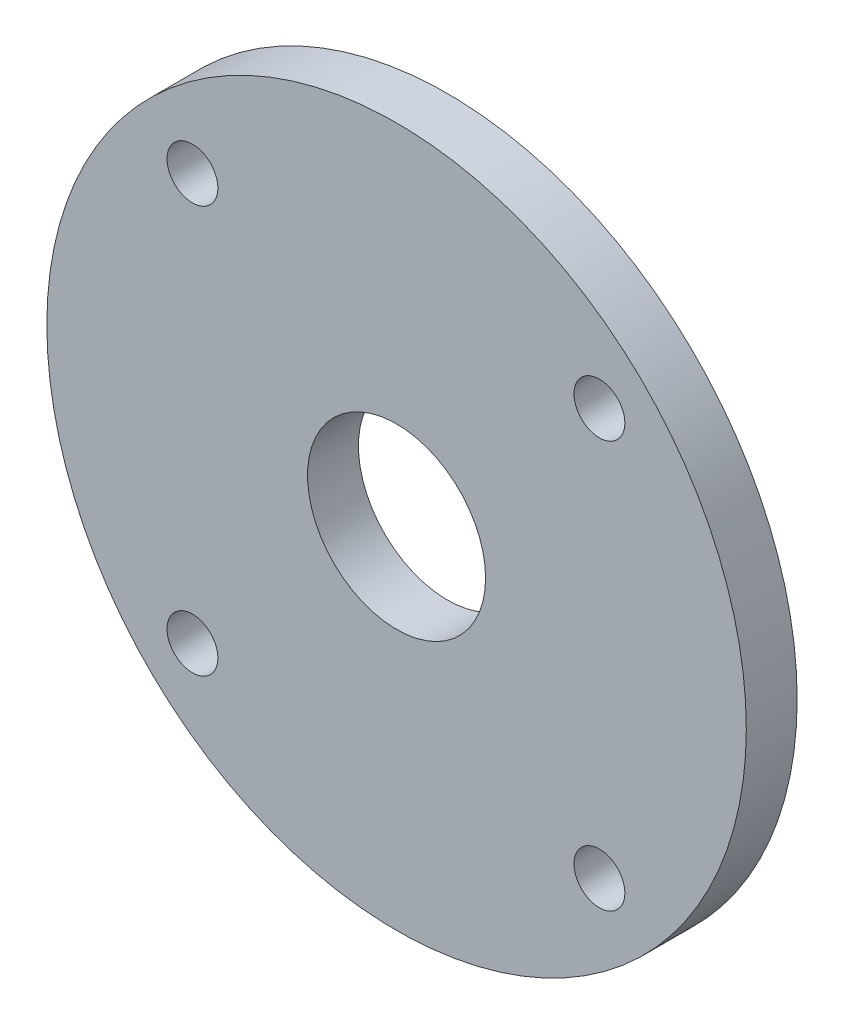
ISO-10303-21;
HEADER;
FILE_DESCRIPTION(('STEP AP214'),'2;1');
FILE_NAME('part.step','',(''),(''),'','','');
FILE_SCHEMA(('AUTOMOTIVE_DESIGN { 1 0 10303 214 1 1 1 1 }'));
ENDSEC;
DATA;
#1=APPLICATION_CONTEXT('core data for automotive mechanical design processes');
#2=APPLICATION_PROTOCOL_DEFINITION('international standard','automotive_design',2000,#1);
#3=PRODUCT_CONTEXT('',#1,'mechanical');
#4=PRODUCT('Part','Part','',(#3));
#5=PRODUCT_RELATED_PRODUCT_CATEGORY('part','',(#4));
#6=PRODUCT_DEFINITION_FORMATION('','',#4);
#7=PRODUCT_DEFINITION_CONTEXT('part definition',#1,'design');
#8=PRODUCT_DEFINITION('design','',#6,#7);
#9=PRODUCT_DEFINITION_SHAPE('','',#8);
#10=(LENGTH_UNIT() NAMED_UNIT(*) SI_UNIT(.MILLI.,.METRE.));
#11=(NAMED_UNIT(*) PLANE_ANGLE_UNIT() SI_UNIT($,.RADIAN.));
#12=(NAMED_UNIT(*) SI_UNIT($,.STERADIAN.) SOLID_ANGLE_UNIT());
#13=UNCERTAINTY_MEASURE_WITH_UNIT(LENGTH_MEASURE(1.E-05),#10,'distance_accuracy_value','');
#14=(GEOMETRIC_REPRESENTATION_CONTEXT(3) GLOBAL_UNCERTAINTY_ASSIGNED_CONTEXT((#13)) GLOBAL_UNIT_ASSIGNED_CONTEXT((#10,
#11,#12)) REPRESENTATION_CONTEXT('',''));
#15=CARTESIAN_POINT('',(0.,0.,0.));
#16=DIRECTION('',(0.,0.,1.));
#17=DIRECTION('',(1.,0.,0.));
#18=AXIS2_PLACEMENT_3D('',#15,#16,#17);
#19=CARTESIAN_POINT('',(0.,0.,4.));
#20=DIRECTION('',(0.,0.,-1.));
#21=DIRECTION('',(-1.,0.,0.));
#22=AXIS2_PLACEMENT_3D('',#19,#20,#21);
#23=CYLINDRICAL_SURFACE('',#22,27.5);
#24=CARTESIAN_POINT('',(0.,0.,4.));
#25=DIRECTION('',(0.,0.,1.));
#26=DIRECTION('',(1.,0.,0.));
#27=AXIS2_PLACEMENT_3D('',#24,#25,#26);
#28=CIRCLE('',#27,27.5);
#29=CARTESIAN_POINT('',(27.5,0.,4.));
#30=VERTEX_POINT('',#29);
#31=EDGE_CURVE('E10',#30,#30,#28,.T.);
#32=ORIENTED_EDGE('',*,*,#31,.F.);
#33=EDGE_LOOP('',(#32));
#34=FACE_BOUND('',#33,.T.);
#35=CARTESIAN_POINT('',(0.,0.,0.));
#36=DIRECTION('',(0.,0.,1.));
#37=DIRECTION('',(1.,0.,0.));
#38=AXIS2_PLACEMENT_3D('',#35,#36,#37);
#39=CIRCLE('',#38,27.5);
#40=CARTESIAN_POINT('',(27.5,0.,0.));
#41=VERTEX_POINT('',#40);
#42=EDGE_CURVE('E46',#41,#41,#39,.T.);
#43=ORIENTED_EDGE('',*,*,#42,.T.);
#44=EDGE_LOOP('',(#43));
#45=FACE_BOUND('',#44,.T.);
#46=ADVANCED_FACE('F43',(#34,#45),#23,.T.);
#47=CARTESIAN_POINT('',(0.,0.,4.));
#48=DIRECTION('',(0.,0.,1.));
#49=DIRECTION('',(1.,0.,0.));
#50=AXIS2_PLACEMENT_3D('',#47,#48,#49);
#51=PLANE('',#50);
#52=CARTESIAN_POINT('',(0.,0.,4.));
#53=DIRECTION('',(0.,0.,1.));
#54=DIRECTION('',(1.,0.,0.));
#55=AXIS2_PLACEMENT_3D('',#52,#53,#54);
#56=CIRCLE('',#55,7.);
#57=CARTESIAN_POINT('',(7.,0.,4.));
#58=VERTEX_POINT('',#57);
#59=EDGE_CURVE('E89',#58,#58,#56,.T.);
#60=ORIENTED_EDGE('',*,*,#59,.F.);
#61=EDGE_LOOP('',(#60));
#62=FACE_BOUND('',#61,.T.);
#63=CARTESIAN_POINT('',(15.9505849957376,16.0247075021312,4.));
#64=DIRECTION('',(0.,0.,1.));
#65=DIRECTION('',(1.,0.,0.));
#66=AXIS2_PLACEMENT_3D('',#63,#64,#65);
#67=CIRCLE('',#66,2.);
#68=CARTESIAN_POINT('',(17.9505849957376,16.0247075021312,4.));
#69=VERTEX_POINT('',#68);
#70=EDGE_CURVE('E69',#69,#69,#67,.T.);
#71=ORIENTED_EDGE('',*,*,#70,.F.);
#72=EDGE_LOOP('',(#71));
#73=FACE_BOUND('',#72,.T.);
#74=CARTESIAN_POINT('',(15.9505849957376,-15.9752924978688,4.));
#75=DIRECTION('',(0.,0.,1.));
#76=DIRECTION('',(1.,0.,0.));
#77=AXIS2_PLACEMENT_3D('',#74,#75,#76);
#78=CIRCLE('',#77,2.);
#79=CARTESIAN_POINT('',(17.9505849957376,-15.9752924978688,4.));
#80=VERTEX_POINT('',#79);
#81=EDGE_CURVE('E78',#80,#80,#78,.T.);
#82=ORIENTED_EDGE('',*,*,#81,.F.);
#83=EDGE_LOOP('',(#82));
#84=FACE_BOUND('',#83,.T.);
#85=CARTESIAN_POINT('',(-16.0494150042624,-15.9752924978688,4.));
#86=DIRECTION('',(0.,0.,1.));
#87=DIRECTION('',(1.,0.,0.));
#88=AXIS2_PLACEMENT_3D('',#85,#86,#87);
#89=CIRCLE('',#88,2.);
#90=CARTESIAN_POINT('',(-14.0494150042624,-15.9752924978688,4.));
#91=VERTEX_POINT('',#90);
#92=EDGE_CURVE('E61',#91,#91,#89,.T.);
#93=ORIENTED_EDGE('',*,*,#92,.F.);
#94=EDGE_LOOP('',(#93));
#95=FACE_BOUND('',#94,.T.);
#96=CARTESIAN_POINT('',(-16.0494150042624,16.0247075021312,4.));
#97=DIRECTION('',(0.,0.,1.));
#98=DIRECTION('',(1.,0.,0.));
#99=AXIS2_PLACEMENT_3D('',#96,#97,#98);
#100=CIRCLE('',#99,2.);
#101=CARTESIAN_POINT('',(-14.0494150042624,16.0247075021312,4.));
#102=VERTEX_POINT('',#101);
#103=EDGE_CURVE('E57',#102,#102,#100,.T.);
#104=ORIENTED_EDGE('',*,*,#103,.F.);
#105=EDGE_LOOP('',(#104));
#106=FACE_BOUND('',#105,.T.);
#107=ORIENTED_EDGE('',*,*,#31,.T.);
#108=EDGE_LOOP('',(#107));
#109=FACE_BOUND('',#108,.T.);
#110=ADVANCED_FACE('F107',(#62,#73,#84,#95,#106,#109),#51,.T.);
#111=CARTESIAN_POINT('',(0.,0.,0.));
#112=DIRECTION('',(0.,0.,1.));
#113=DIRECTION('',(1.,0.,0.));
#114=AXIS2_PLACEMENT_3D('',#111,#112,#113);
#115=PLANE('',#114);
#116=CARTESIAN_POINT('',(0.,0.,0.));
#117=DIRECTION('',(0.,0.,1.));
#118=DIRECTION('',(1.,0.,0.));
#119=AXIS2_PLACEMENT_3D('',#116,#117,#118);
#120=CIRCLE('',#119,7.);
#121=CARTESIAN_POINT('',(7.,0.,0.));
#122=VERTEX_POINT('',#121);
#123=EDGE_CURVE('E70',#122,#122,#120,.T.);
#124=ORIENTED_EDGE('',*,*,#123,.T.);
#125=EDGE_LOOP('',(#124));
#126=FACE_BOUND('',#125,.T.);
#127=CARTESIAN_POINT('',(15.9505849957376,16.0247075021312,0.));
#128=DIRECTION('',(0.,0.,1.));
#129=DIRECTION('',(1.,0.,0.));
#130=AXIS2_PLACEMENT_3D('',#127,#128,#129);
#131=CIRCLE('',#130,2.);
#132=CARTESIAN_POINT('',(17.9505849957376,16.0247075021312,0.));
#133=VERTEX_POINT('',#132);
#134=EDGE_CURVE('E65',#133,#133,#131,.T.);
#135=ORIENTED_EDGE('',*,*,#134,.T.);
#136=EDGE_LOOP('',(#135));
#137=FACE_BOUND('',#136,.T.);
#138=CARTESIAN_POINT('',(15.9505849957376,-15.9752924978688,0.));
#139=DIRECTION('',(0.,0.,1.));
#140=DIRECTION('',(1.,0.,0.));
#141=AXIS2_PLACEMENT_3D('',#138,#139,#140);
#142=CIRCLE('',#141,2.);
#143=CARTESIAN_POINT('',(17.9505849957376,-15.9752924978688,0.));
#144=VERTEX_POINT('',#143);
#145=EDGE_CURVE('E74',#144,#144,#142,.T.);
#146=ORIENTED_EDGE('',*,*,#145,.T.);
#147=EDGE_LOOP('',(#146));
#148=FACE_BOUND('',#147,.T.);
#149=CARTESIAN_POINT('',(-16.0494150042624,-15.9752924978688,0.));
#150=DIRECTION('',(0.,0.,1.));
#151=DIRECTION('',(1.,0.,0.));
#152=AXIS2_PLACEMENT_3D('',#149,#150,#151);
#153=CIRCLE('',#152,2.);
#154=CARTESIAN_POINT('',(-14.0494150042624,-15.9752924978688,0.));
#155=VERTEX_POINT('',#154);
#156=EDGE_CURVE('E82',#155,#155,#153,.T.);
#157=ORIENTED_EDGE('',*,*,#156,.T.);
#158=EDGE_LOOP('',(#157));
#159=FACE_BOUND('',#158,.T.);
#160=CARTESIAN_POINT('',(-16.0494150042624,16.0247075021312,0.));
#161=DIRECTION('',(0.,0.,1.));
#162=DIRECTION('',(1.,0.,0.));
#163=AXIS2_PLACEMENT_3D('',#160,#161,#162);
#164=CIRCLE('',#163,2.);
#165=CARTESIAN_POINT('',(-14.0494150042624,16.0247075021312,0.));
#166=VERTEX_POINT('',#165);
#167=EDGE_CURVE('E55',#166,#166,#164,.T.);
#168=ORIENTED_EDGE('',*,*,#167,.T.);
#169=EDGE_LOOP('',(#168));
#170=FACE_BOUND('',#169,.T.);
#171=ORIENTED_EDGE('',*,*,#42,.F.);
#172=EDGE_LOOP('',(#171));
#173=FACE_BOUND('',#172,.T.);
#174=ADVANCED_FACE('F97',(#126,#137,#148,#159,#170,#173),#115,.F.);
#175=CARTESIAN_POINT('',(-16.0494150042624,16.0247075021312,0.));
#176=DIRECTION('',(0.,0.,1.));
#177=DIRECTION('',(1.,0.,0.));
#178=AXIS2_PLACEMENT_3D('',#175,#176,#177);
#179=CYLINDRICAL_SURFACE('',#178,2.);
#180=ORIENTED_EDGE('',*,*,#103,.T.);
#181=EDGE_LOOP('',(#180));
#182=FACE_BOUND('',#181,.T.);
#183=ORIENTED_EDGE('',*,*,#167,.F.);
#184=EDGE_LOOP('',(#183));
#185=FACE_BOUND('',#184,.T.);
#186=ADVANCED_FACE('F119',(#182,#185),#179,.F.);
#187=CARTESIAN_POINT('',(-16.0494150042624,-15.9752924978688,0.));
#188=DIRECTION('',(0.,0.,1.));
#189=DIRECTION('',(1.,0.,0.));
#190=AXIS2_PLACEMENT_3D('',#187,#188,#189);
#191=CYLINDRICAL_SURFACE('',#190,2.);
#192=ORIENTED_EDGE('',*,*,#92,.T.);
#193=EDGE_LOOP('',(#192));
#194=FACE_BOUND('',#193,.T.);
#195=ORIENTED_EDGE('',*,*,#156,.F.);
#196=EDGE_LOOP('',(#195));
#197=FACE_BOUND('',#196,.T.);
#198=ADVANCED_FACE('F122',(#194,#197),#191,.F.);
#199=CARTESIAN_POINT('',(15.9505849957376,-15.9752924978688,0.));
#200=DIRECTION('',(0.,0.,1.));
#201=DIRECTION('',(1.,0.,0.));
#202=AXIS2_PLACEMENT_3D('',#199,#200,#201);
#203=CYLINDRICAL_SURFACE('',#202,2.);
#204=ORIENTED_EDGE('',*,*,#81,.T.);
#205=EDGE_LOOP('',(#204));
#206=FACE_BOUND('',#205,.T.);
#207=ORIENTED_EDGE('',*,*,#145,.F.);
#208=EDGE_LOOP('',(#207));
#209=FACE_BOUND('',#208,.T.);
#210=ADVANCED_FACE('F148',(#206,#209),#203,.F.);
#211=CARTESIAN_POINT('',(15.9505849957376,16.0247075021312,0.));
#212=DIRECTION('',(0.,0.,1.));
#213=DIRECTION('',(1.,0.,0.));
#214=AXIS2_PLACEMENT_3D('',#211,#212,#213);
#215=CYLINDRICAL_SURFACE('',#214,2.);
#216=ORIENTED_EDGE('',*,*,#70,.T.);
#217=EDGE_LOOP('',(#216));
#218=FACE_BOUND('',#217,.T.);
#219=ORIENTED_EDGE('',*,*,#134,.F.);
#220=EDGE_LOOP('',(#219));
#221=FACE_BOUND('',#220,.T.);
#222=ADVANCED_FACE('F103',(#218,#221),#215,.F.);
#223=CARTESIAN_POINT('',(0.,0.,0.));
#224=DIRECTION('',(0.,0.,1.));
#225=DIRECTION('',(1.,0.,0.));
#226=AXIS2_PLACEMENT_3D('',#223,#224,#225);
#227=CYLINDRICAL_SURFACE('',#226,7.);
#228=ORIENTED_EDGE('',*,*,#123,.F.);
#229=EDGE_LOOP('',(#228));
#230=FACE_BOUND('',#229,.T.);
#231=ORIENTED_EDGE('',*,*,#59,.T.);
#232=EDGE_LOOP('',(#231));
#233=FACE_BOUND('',#232,.T.);
#234=ADVANCED_FACE('F100',(#230,#233),#227,.F.);
#235=CLOSED_SHELL('',(#46,#110,#174,#186,#198,#210,#222,#234));
#236=MANIFOLD_SOLID_BREP('B2',#235);
#237=ADVANCED_BREP_SHAPE_REPRESENTATION('',(#18,#236),#14);
#238=SHAPE_DEFINITION_REPRESENTATION(#9,#237);
ENDSEC;
END-ISO-10303-21;
